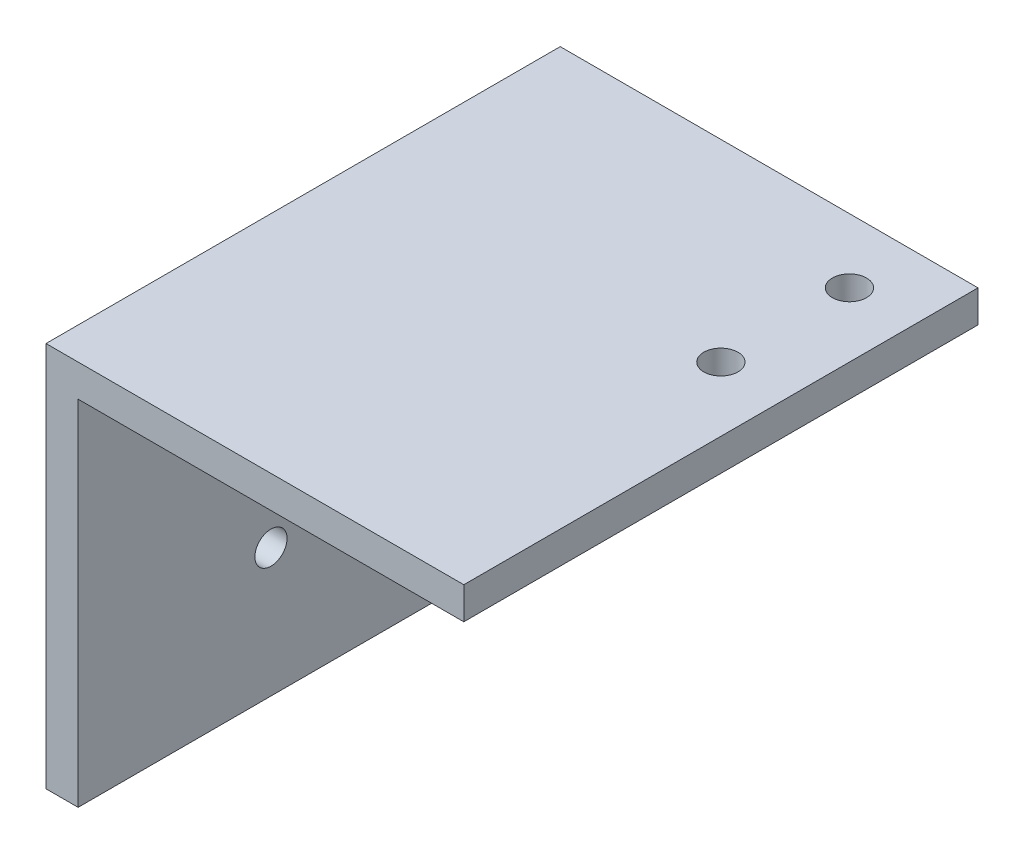
ISO-10303-21;
HEADER;
FILE_DESCRIPTION(('STEP AP214'),'2;1');
FILE_NAME('part.step','',(''),(''),'','','');
FILE_SCHEMA(('AUTOMOTIVE_DESIGN { 1 0 10303 214 1 1 1 1 }'));
ENDSEC;
DATA;
#1=APPLICATION_CONTEXT('core data for automotive mechanical design processes');
#2=APPLICATION_PROTOCOL_DEFINITION('international standard','automotive_design',2000,#1);
#3=PRODUCT_CONTEXT('',#1,'mechanical');
#4=PRODUCT('Part','Part','',(#3));
#5=PRODUCT_RELATED_PRODUCT_CATEGORY('part','',(#4));
#6=PRODUCT_DEFINITION_FORMATION('','',#4);
#7=PRODUCT_DEFINITION_CONTEXT('part definition',#1,'design');
#8=PRODUCT_DEFINITION('design','',#6,#7);
#9=PRODUCT_DEFINITION_SHAPE('','',#8);
#10=(LENGTH_UNIT() NAMED_UNIT(*) SI_UNIT(.MILLI.,.METRE.));
#11=(NAMED_UNIT(*) PLANE_ANGLE_UNIT() SI_UNIT($,.RADIAN.));
#12=(NAMED_UNIT(*) SI_UNIT($,.STERADIAN.) SOLID_ANGLE_UNIT());
#13=UNCERTAINTY_MEASURE_WITH_UNIT(LENGTH_MEASURE(1.E-05),#10,'distance_accuracy_value','');
#14=(GEOMETRIC_REPRESENTATION_CONTEXT(3) GLOBAL_UNCERTAINTY_ASSIGNED_CONTEXT((#13)) GLOBAL_UNIT_ASSIGNED_CONTEXT((#10,
#11,#12)) REPRESENTATION_CONTEXT('',''));
#15=CARTESIAN_POINT('',(0.,0.,0.));
#16=DIRECTION('',(0.,0.,1.));
#17=DIRECTION('',(1.,0.,0.));
#18=AXIS2_PLACEMENT_3D('',#15,#16,#17);
#19=CARTESIAN_POINT('',(33.8636711350193,151.471127611832,-66.1040366402132));
#20=DIRECTION('',(0.,-1.,0.));
#21=DIRECTION('',(0.,0.,-1.));
#22=AXIS2_PLACEMENT_3D('',#19,#20,#21);
#23=CYLINDRICAL_SURFACE('',#22,3.3782);
#24=CARTESIAN_POINT('',(33.8636711350193,6.35,-66.1040366402132));
#25=DIRECTION('',(0.,-1.,0.));
#26=DIRECTION('',(0.,0.,-1.));
#27=AXIS2_PLACEMENT_3D('',#24,#25,#26);
#28=CIRCLE('',#27,3.3782);
#29=CARTESIAN_POINT('',(33.8636711350193,6.35,-69.4822366402132));
#30=VERTEX_POINT('',#29);
#31=EDGE_CURVE('E89',#30,#30,#28,.T.);
#32=ORIENTED_EDGE('',*,*,#31,.F.);
#33=EDGE_LOOP('',(#32));
#34=FACE_BOUND('',#33,.T.);
#35=CARTESIAN_POINT('',(33.8636711350193,0.,-66.1040366402132));
#36=DIRECTION('',(0.,1.,0.));
#37=DIRECTION('',(1.,0.,0.));
#38=AXIS2_PLACEMENT_3D('',#35,#36,#37);
#39=CIRCLE('',#38,3.3782);
#40=CARTESIAN_POINT('',(37.2418711350193,0.,-66.1040366402132));
#41=VERTEX_POINT('',#40);
#42=EDGE_CURVE('E101',#41,#41,#39,.T.);
#43=ORIENTED_EDGE('',*,*,#42,.F.);
#44=EDGE_LOOP('',(#43));
#45=FACE_BOUND('',#44,.T.);
#46=ADVANCED_FACE('F16',(#34,#45),#23,.F.);
#47=CARTESIAN_POINT('',(33.8636711348359,151.471127611832,-40.7040366402141));
#48=DIRECTION('',(0.,-1.,0.));
#49=DIRECTION('',(0.,0.,-1.));
#50=AXIS2_PLACEMENT_3D('',#47,#48,#49);
#51=CYLINDRICAL_SURFACE('',#50,3.3782);
#52=CARTESIAN_POINT('',(33.8636711348359,6.35,-40.7040366402141));
#53=DIRECTION('',(0.,-1.,0.));
#54=DIRECTION('',(0.,0.,-1.));
#55=AXIS2_PLACEMENT_3D('',#52,#53,#54);
#56=CIRCLE('',#55,3.3782);
#57=CARTESIAN_POINT('',(33.8636711348359,6.35,-44.0822366402141));
#58=VERTEX_POINT('',#57);
#59=EDGE_CURVE('E93',#58,#58,#56,.T.);
#60=ORIENTED_EDGE('',*,*,#59,.F.);
#61=EDGE_LOOP('',(#60));
#62=FACE_BOUND('',#61,.T.);
#63=CARTESIAN_POINT('',(33.8636711348359,0.,-40.7040366402141));
#64=DIRECTION('',(0.,1.,0.));
#65=DIRECTION('',(1.,0.,0.));
#66=AXIS2_PLACEMENT_3D('',#63,#64,#65);
#67=CIRCLE('',#66,3.3782);
#68=CARTESIAN_POINT('',(37.2418711348359,0.,-40.7040366402141));
#69=VERTEX_POINT('',#68);
#70=EDGE_CURVE('E103',#69,#69,#67,.T.);
#71=ORIENTED_EDGE('',*,*,#70,.F.);
#72=EDGE_LOOP('',(#71));
#73=FACE_BOUND('',#72,.T.);
#74=ADVANCED_FACE('F167',(#62,#73),#51,.F.);
#75=CARTESIAN_POINT('',(-29.6363288652562,-19.05,-28.004036640267));
#76=DIRECTION('',(-1.,0.,0.));
#77=DIRECTION('',(0.,0.,1.));
#78=AXIS2_PLACEMENT_3D('',#75,#76,#77);
#79=CYLINDRICAL_SURFACE('',#78,3.175);
#80=CARTESIAN_POINT('',(-35.9863288652562,-19.05,-28.004036640267));
#81=DIRECTION('',(1.,0.,0.));
#82=DIRECTION('',(0.,1.,0.));
#83=AXIS2_PLACEMENT_3D('',#80,#81,#82);
#84=CIRCLE('',#83,3.175);
#85=CARTESIAN_POINT('',(-35.9863288652562,-15.875,-28.004036640267));
#86=VERTEX_POINT('',#85);
#87=EDGE_CURVE('E108',#86,#86,#84,.T.);
#88=ORIENTED_EDGE('',*,*,#87,.F.);
#89=EDGE_LOOP('',(#88));
#90=FACE_BOUND('',#89,.T.);
#91=CARTESIAN_POINT('',(-29.6363288652562,-19.05,-28.004036640267));
#92=DIRECTION('',(-1.,0.,0.));
#93=DIRECTION('',(0.,1.,0.));
#94=AXIS2_PLACEMENT_3D('',#91,#92,#93);
#95=CIRCLE('',#94,3.175);
#96=CARTESIAN_POINT('',(-29.6363288652562,-15.875,-28.004036640267));
#97=VERTEX_POINT('',#96);
#98=EDGE_CURVE('E77',#97,#97,#95,.T.);
#99=ORIENTED_EDGE('',*,*,#98,.F.);
#100=EDGE_LOOP('',(#99));
#101=FACE_BOUND('',#100,.T.);
#102=ADVANCED_FACE('F163',(#90,#101),#79,.F.);
#103=CARTESIAN_POINT('',(-29.6363288652562,-44.45,-15.304036640267));
#104=DIRECTION('',(-1.,0.,0.));
#105=DIRECTION('',(0.,1.,0.));
#106=AXIS2_PLACEMENT_3D('',#103,#104,#105);
#107=CYLINDRICAL_SURFACE('',#106,3.175);
#108=CARTESIAN_POINT('',(-35.9863288652562,-44.45,-15.304036640267));
#109=DIRECTION('',(1.,0.,0.));
#110=DIRECTION('',(0.,1.,0.));
#111=AXIS2_PLACEMENT_3D('',#108,#109,#110);
#112=CIRCLE('',#111,3.175);
#113=CARTESIAN_POINT('',(-35.9863288652562,-41.275,-15.304036640267));
#114=VERTEX_POINT('',#113);
#115=EDGE_CURVE('E112',#114,#114,#112,.T.);
#116=ORIENTED_EDGE('',*,*,#115,.F.);
#117=EDGE_LOOP('',(#116));
#118=FACE_BOUND('',#117,.T.);
#119=CARTESIAN_POINT('',(-29.6363288652562,-44.45,-15.304036640267));
#120=DIRECTION('',(-1.,0.,0.));
#121=DIRECTION('',(0.,1.,0.));
#122=AXIS2_PLACEMENT_3D('',#119,#120,#121);
#123=CIRCLE('',#122,3.175);
#124=CARTESIAN_POINT('',(-29.6363288652562,-41.275,-15.304036640267));
#125=VERTEX_POINT('',#124);
#126=EDGE_CURVE('E111',#125,#125,#123,.T.);
#127=ORIENTED_EDGE('',*,*,#126,.F.);
#128=EDGE_LOOP('',(#127));
#129=FACE_BOUND('',#128,.T.);
#130=ADVANCED_FACE('F18',(#118,#129),#107,.F.);
#131=CARTESIAN_POINT('',(-11.4753288652562,-14.986,22.795963359733));
#132=DIRECTION('',(0.,0.,1.));
#133=DIRECTION('',(1.,0.,0.));
#134=AXIS2_PLACEMENT_3D('',#131,#132,#133);
#135=PLANE('',#134);
#136=DIRECTION('',(1.,0.,0.));
#137=VECTOR('',#136,1.);
#138=CARTESIAN_POINT('',(-29.6363288652562,0.,22.795963359733));
#139=LINE('',#138,#137);
#140=CARTESIAN_POINT('',(-29.6363288652562,0.,22.795963359733));
#141=VERTEX_POINT('',#140);
#142=CARTESIAN_POINT('',(46.5636711347438,0.,22.795963359733));
#143=VERTEX_POINT('',#142);
#144=EDGE_CURVE('E11',#141,#143,#139,.T.);
#145=ORIENTED_EDGE('',*,*,#144,.T.);
#146=DIRECTION('',(0.,1.,0.));
#147=VECTOR('',#146,1.);
#148=CARTESIAN_POINT('',(46.5636711347438,0.,22.795963359733));
#149=LINE('',#148,#147);
#150=CARTESIAN_POINT('',(46.5636711347438,6.35,22.795963359733));
#151=VERTEX_POINT('',#150);
#152=EDGE_CURVE('E26',#143,#151,#149,.T.);
#153=ORIENTED_EDGE('',*,*,#152,.T.);
#154=DIRECTION('',(-1.,0.,0.));
#155=VECTOR('',#154,1.);
#156=CARTESIAN_POINT('',(46.5636711347438,6.35,22.795963359733));
#157=LINE('',#156,#155);
#158=CARTESIAN_POINT('',(-35.9863288652562,6.35,22.795963359733));
#159=VERTEX_POINT('',#158);
#160=EDGE_CURVE('E87',#151,#159,#157,.T.);
#161=ORIENTED_EDGE('',*,*,#160,.T.);
#162=DIRECTION('',(0.,-1.,0.));
#163=VECTOR('',#162,1.);
#164=CARTESIAN_POINT('',(-35.9863288652562,6.35,22.795963359733));
#165=LINE('',#164,#163);
#166=CARTESIAN_POINT('',(-35.9863288652562,-69.85,22.795963359733));
#167=VERTEX_POINT('',#166);
#168=EDGE_CURVE('E121',#159,#167,#165,.T.);
#169=ORIENTED_EDGE('',*,*,#168,.T.);
#170=DIRECTION('',(1.,0.,0.));
#171=VECTOR('',#170,1.);
#172=CARTESIAN_POINT('',(-35.9863288652562,-69.85,22.795963359733));
#173=LINE('',#172,#171);
#174=CARTESIAN_POINT('',(-29.6363288652562,-69.85,22.795963359733));
#175=VERTEX_POINT('',#174);
#176=EDGE_CURVE('E124',#167,#175,#173,.T.);
#177=ORIENTED_EDGE('',*,*,#176,.T.);
#178=DIRECTION('',(0.,1.,0.));
#179=VECTOR('',#178,1.);
#180=CARTESIAN_POINT('',(-29.6363288652562,-69.85,22.795963359733));
#181=LINE('',#180,#179);
#182=EDGE_CURVE('E127',#175,#141,#181,.T.);
#183=ORIENTED_EDGE('',*,*,#182,.T.);
#184=EDGE_LOOP('',(#145,#153,#161,#169,#177,#183));
#185=FACE_BOUND('',#184,.T.);
#186=ADVANCED_FACE('F154',(#185),#135,.T.);
#187=CARTESIAN_POINT('',(-32.8113288652562,-69.85,-34.354036640267));
#188=DIRECTION('',(0.,1.,0.));
#189=DIRECTION('',(0.,0.,1.));
#190=AXIS2_PLACEMENT_3D('',#187,#188,#189);
#191=PLANE('',#190);
#192=DIRECTION('',(0.,0.,1.));
#193=VECTOR('',#192,1.);
#194=CARTESIAN_POINT('',(-29.6363288652562,-69.85,-78.804036640267));
#195=LINE('',#194,#193);
#196=CARTESIAN_POINT('',(-29.6363288652562,-69.85,-78.804036640267));
#197=VERTEX_POINT('',#196);
#198=EDGE_CURVE('E130',#197,#175,#195,.T.);
#199=ORIENTED_EDGE('',*,*,#198,.T.);
#200=ORIENTED_EDGE('',*,*,#176,.F.);
#201=DIRECTION('',(0.,0.,1.));
#202=VECTOR('',#201,1.);
#203=CARTESIAN_POINT('',(-35.9863288652562,-69.85,10.095963359733));
#204=LINE('',#203,#202);
#205=CARTESIAN_POINT('',(-35.9863288652562,-69.85,-78.804036640267));
#206=VERTEX_POINT('',#205);
#207=EDGE_CURVE('E88',#206,#167,#204,.T.);
#208=ORIENTED_EDGE('',*,*,#207,.F.);
#209=DIRECTION('',(1.,0.,0.));
#210=VECTOR('',#209,1.);
#211=CARTESIAN_POINT('',(-35.9863288652562,-69.85,-78.804036640267));
#212=LINE('',#211,#210);
#213=EDGE_CURVE('E132',#206,#197,#212,.T.);
#214=ORIENTED_EDGE('',*,*,#213,.T.);
#215=EDGE_LOOP('',(#199,#200,#208,#214));
#216=FACE_BOUND('',#215,.T.);
#217=ADVANCED_FACE('F150',(#216),#191,.F.);
#218=CARTESIAN_POINT('',(-7.41132886525619,-6.35,-78.804036640267));
#219=DIRECTION('',(0.,0.,1.));
#220=DIRECTION('',(1.,0.,0.));
#221=AXIS2_PLACEMENT_3D('',#218,#219,#220);
#222=PLANE('',#221);
#223=DIRECTION('',(-1.,0.,0.));
#224=VECTOR('',#223,1.);
#225=CARTESIAN_POINT('',(46.5636711347438,0.,-78.804036640267));
#226=LINE('',#225,#224);
#227=CARTESIAN_POINT('',(46.5636711347438,0.,-78.804036640267));
#228=VERTEX_POINT('',#227);
#229=CARTESIAN_POINT('',(-29.6363288652562,0.,-78.804036640267));
#230=VERTEX_POINT('',#229);
#231=EDGE_CURVE('E135',#228,#230,#226,.T.);
#232=ORIENTED_EDGE('',*,*,#231,.T.);
#233=DIRECTION('',(0.,-1.,0.));
#234=VECTOR('',#233,1.);
#235=CARTESIAN_POINT('',(-29.6363288652562,0.,-78.804036640267));
#236=LINE('',#235,#234);
#237=EDGE_CURVE('E83',#230,#197,#236,.T.);
#238=ORIENTED_EDGE('',*,*,#237,.T.);
#239=ORIENTED_EDGE('',*,*,#213,.F.);
#240=DIRECTION('',(0.,-1.,0.));
#241=VECTOR('',#240,1.);
#242=CARTESIAN_POINT('',(-35.9863288652562,-44.45,-78.804036640267));
#243=LINE('',#242,#241);
#244=CARTESIAN_POINT('',(-35.9863288652562,6.35,-78.804036640267));
#245=VERTEX_POINT('',#244);
#246=EDGE_CURVE('E66',#245,#206,#243,.T.);
#247=ORIENTED_EDGE('',*,*,#246,.F.);
#248=DIRECTION('',(1.,0.,0.));
#249=VECTOR('',#248,1.);
#250=CARTESIAN_POINT('',(-35.9863288652562,6.35,-78.804036640267));
#251=LINE('',#250,#249);
#252=CARTESIAN_POINT('',(46.5636711347438,6.35,-78.804036640267));
#253=VERTEX_POINT('',#252);
#254=EDGE_CURVE('E76',#245,#253,#251,.T.);
#255=ORIENTED_EDGE('',*,*,#254,.T.);
#256=DIRECTION('',(0.,-1.,0.));
#257=VECTOR('',#256,1.);
#258=CARTESIAN_POINT('',(46.5636711347438,6.35,-78.804036640267));
#259=LINE('',#258,#257);
#260=EDGE_CURVE('E69',#253,#228,#259,.T.);
#261=ORIENTED_EDGE('',*,*,#260,.T.);
#262=EDGE_LOOP('',(#232,#238,#239,#247,#255,#261));
#263=FACE_BOUND('',#262,.T.);
#264=ADVANCED_FACE('F79',(#263),#222,.F.);
#265=CARTESIAN_POINT('',(-29.6363288652562,-19.05,-21.654036640267));
#266=DIRECTION('',(1.,0.,0.));
#267=DIRECTION('',(0.,0.,-1.));
#268=AXIS2_PLACEMENT_3D('',#265,#266,#267);
#269=PLANE('',#268);
#270=ORIENTED_EDGE('',*,*,#98,.T.);
#271=EDGE_LOOP('',(#270));
#272=FACE_BOUND('',#271,.T.);
#273=ORIENTED_EDGE('',*,*,#126,.T.);
#274=EDGE_LOOP('',(#273));
#275=FACE_BOUND('',#274,.T.);
#276=DIRECTION('',(0.,0.,-1.));
#277=VECTOR('',#276,1.);
#278=CARTESIAN_POINT('',(-29.6363288652562,0.,10.095963359733));
#279=LINE('',#278,#277);
#280=EDGE_CURVE('E107',#141,#230,#279,.T.);
#281=ORIENTED_EDGE('',*,*,#280,.F.);
#282=ORIENTED_EDGE('',*,*,#182,.F.);
#283=ORIENTED_EDGE('',*,*,#198,.F.);
#284=ORIENTED_EDGE('',*,*,#237,.F.);
#285=EDGE_LOOP('',(#281,#282,#283,#284));
#286=FACE_BOUND('',#285,.T.);
#287=ADVANCED_FACE('F148',(#272,#275,#286),#269,.T.);
#288=CARTESIAN_POINT('',(-35.9863288652562,-19.05,-21.654036640267));
#289=DIRECTION('',(1.,0.,0.));
#290=DIRECTION('',(0.,0.,-1.));
#291=AXIS2_PLACEMENT_3D('',#288,#289,#290);
#292=PLANE('',#291);
#293=ORIENTED_EDGE('',*,*,#87,.T.);
#294=EDGE_LOOP('',(#293));
#295=FACE_BOUND('',#294,.T.);
#296=ORIENTED_EDGE('',*,*,#115,.T.);
#297=EDGE_LOOP('',(#296));
#298=FACE_BOUND('',#297,.T.);
#299=DIRECTION('',(0.,0.,1.));
#300=VECTOR('',#299,1.);
#301=CARTESIAN_POINT('',(-35.9863288652562,6.35,10.095963359733));
#302=LINE('',#301,#300);
#303=EDGE_CURVE('E98',#245,#159,#302,.T.);
#304=ORIENTED_EDGE('',*,*,#303,.F.);
#305=ORIENTED_EDGE('',*,*,#246,.T.);
#306=ORIENTED_EDGE('',*,*,#207,.T.);
#307=ORIENTED_EDGE('',*,*,#168,.F.);
#308=EDGE_LOOP('',(#304,#305,#306,#307));
#309=FACE_BOUND('',#308,.T.);
#310=ADVANCED_FACE('F152',(#295,#298,#309),#292,.F.);
#311=CARTESIAN_POINT('',(46.5636711347438,0.,10.095963359733));
#312=DIRECTION('',(1.,0.,0.));
#313=DIRECTION('',(0.,0.,-1.));
#314=AXIS2_PLACEMENT_3D('',#311,#312,#313);
#315=PLANE('',#314);
#316=DIRECTION('',(0.,0.,1.));
#317=VECTOR('',#316,1.);
#318=CARTESIAN_POINT('',(46.5636711347438,0.,10.095963359733));
#319=LINE('',#318,#317);
#320=EDGE_CURVE('E73',#228,#143,#319,.T.);
#321=ORIENTED_EDGE('',*,*,#320,.F.);
#322=ORIENTED_EDGE('',*,*,#260,.F.);
#323=DIRECTION('',(0.,0.,1.));
#324=VECTOR('',#323,1.);
#325=CARTESIAN_POINT('',(46.5636711347438,6.35,10.095963359733));
#326=LINE('',#325,#324);
#327=EDGE_CURVE('E20',#253,#151,#326,.T.);
#328=ORIENTED_EDGE('',*,*,#327,.T.);
#329=ORIENTED_EDGE('',*,*,#152,.F.);
#330=EDGE_LOOP('',(#321,#322,#328,#329));
#331=FACE_BOUND('',#330,.T.);
#332=ADVANCED_FACE('F70',(#331),#315,.T.);
#333=CARTESIAN_POINT('',(8.46367113474381,6.35,-21.654036640267));
#334=DIRECTION('',(0.,-1.,0.));
#335=DIRECTION('',(0.,0.,-1.));
#336=AXIS2_PLACEMENT_3D('',#333,#334,#335);
#337=PLANE('',#336);
#338=ORIENTED_EDGE('',*,*,#31,.T.);
#339=EDGE_LOOP('',(#338));
#340=FACE_BOUND('',#339,.T.);
#341=ORIENTED_EDGE('',*,*,#59,.T.);
#342=EDGE_LOOP('',(#341));
#343=FACE_BOUND('',#342,.T.);
#344=ORIENTED_EDGE('',*,*,#327,.F.);
#345=ORIENTED_EDGE('',*,*,#254,.F.);
#346=ORIENTED_EDGE('',*,*,#303,.T.);
#347=ORIENTED_EDGE('',*,*,#160,.F.);
#348=EDGE_LOOP('',(#344,#345,#346,#347));
#349=FACE_BOUND('',#348,.T.);
#350=ADVANCED_FACE('F85',(#340,#343,#349),#337,.F.);
#351=CARTESIAN_POINT('',(8.46367113474381,0.,-21.654036640267));
#352=DIRECTION('',(0.,-1.,0.));
#353=DIRECTION('',(0.,0.,-1.));
#354=AXIS2_PLACEMENT_3D('',#351,#352,#353);
#355=PLANE('',#354);
#356=ORIENTED_EDGE('',*,*,#42,.T.);
#357=EDGE_LOOP('',(#356));
#358=FACE_BOUND('',#357,.T.);
#359=ORIENTED_EDGE('',*,*,#70,.T.);
#360=EDGE_LOOP('',(#359));
#361=FACE_BOUND('',#360,.T.);
#362=ORIENTED_EDGE('',*,*,#280,.T.);
#363=ORIENTED_EDGE('',*,*,#231,.F.);
#364=ORIENTED_EDGE('',*,*,#320,.T.);
#365=ORIENTED_EDGE('',*,*,#144,.F.);
#366=EDGE_LOOP('',(#362,#363,#364,#365));
#367=FACE_BOUND('',#366,.T.);
#368=ADVANCED_FACE('F144',(#358,#361,#367),#355,.T.);
#369=CLOSED_SHELL('',(#46,#74,#102,#130,#186,#217,#264,#287,#310,#332,#350,#368));
#370=MANIFOLD_SOLID_BREP('B1',#369);
#371=ADVANCED_BREP_SHAPE_REPRESENTATION('',(#18,#370),#14);
#372=SHAPE_DEFINITION_REPRESENTATION(#9,#371);
ENDSEC;
END-ISO-10303-21;
